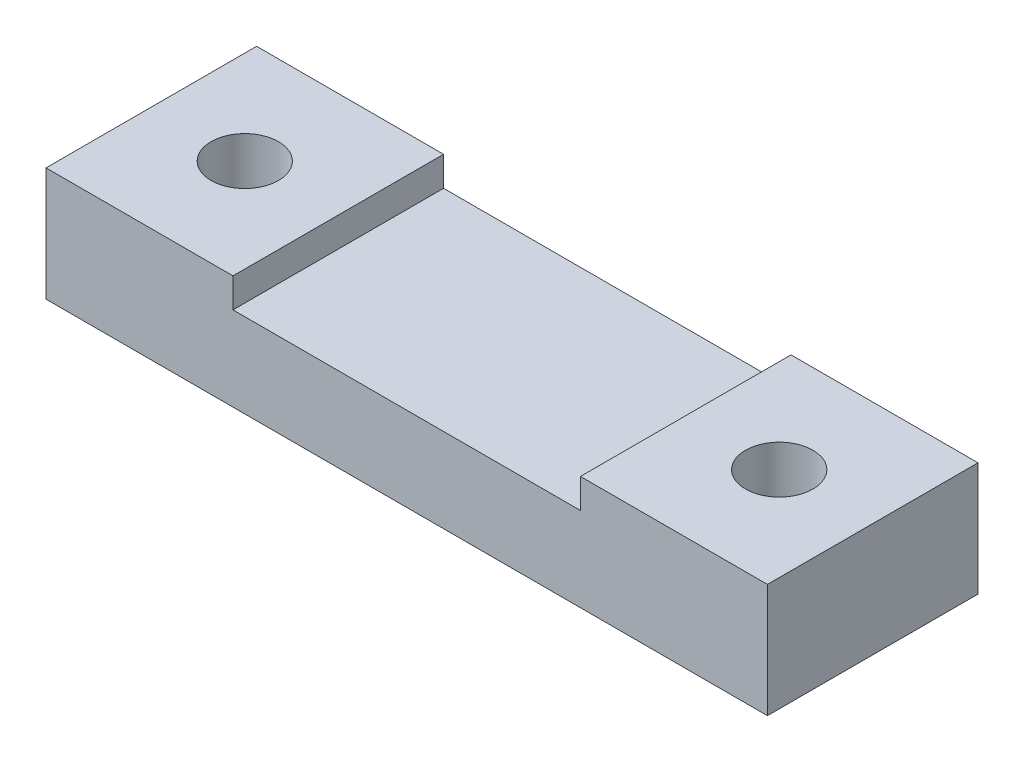
ISO-10303-21;
HEADER;
FILE_DESCRIPTION(('STEP AP214'),'2;1');
FILE_NAME('part.step','',(''),(''),'','','');
FILE_SCHEMA(('AUTOMOTIVE_DESIGN { 1 0 10303 214 1 1 1 1 }'));
ENDSEC;
DATA;
#1=APPLICATION_CONTEXT('core data for automotive mechanical design processes');
#2=APPLICATION_PROTOCOL_DEFINITION('international standard','automotive_design',2000,#1);
#3=PRODUCT_CONTEXT('',#1,'mechanical');
#4=PRODUCT('Part','Part','',(#3));
#5=PRODUCT_RELATED_PRODUCT_CATEGORY('part','',(#4));
#6=PRODUCT_DEFINITION_FORMATION('','',#4);
#7=PRODUCT_DEFINITION_CONTEXT('part definition',#1,'design');
#8=PRODUCT_DEFINITION('design','',#6,#7);
#9=PRODUCT_DEFINITION_SHAPE('','',#8);
#10=(LENGTH_UNIT() NAMED_UNIT(*) SI_UNIT(.MILLI.,.METRE.));
#11=(NAMED_UNIT(*) PLANE_ANGLE_UNIT() SI_UNIT($,.RADIAN.));
#12=(NAMED_UNIT(*) SI_UNIT($,.STERADIAN.) SOLID_ANGLE_UNIT());
#13=UNCERTAINTY_MEASURE_WITH_UNIT(LENGTH_MEASURE(1.E-05),#10,'distance_accuracy_value','');
#14=(GEOMETRIC_REPRESENTATION_CONTEXT(3) GLOBAL_UNCERTAINTY_ASSIGNED_CONTEXT((#13)) GLOBAL_UNIT_ASSIGNED_CONTEXT((#10,
#11,#12)) REPRESENTATION_CONTEXT('',''));
#15=CARTESIAN_POINT('',(0.,0.,0.));
#16=DIRECTION('',(0.,0.,1.));
#17=DIRECTION('',(1.,0.,0.));
#18=AXIS2_PLACEMENT_3D('',#15,#16,#17);
#19=CARTESIAN_POINT('',(0.,0.,0.));
#20=DIRECTION('',(0.,1.,0.));
#21=DIRECTION('',(0.,0.,1.));
#22=AXIS2_PLACEMENT_3D('',#19,#20,#21);
#23=PLANE('',#22);
#24=DIRECTION('',(1.,0.,0.));
#25=VECTOR('',#24,1.);
#26=CARTESIAN_POINT('',(0.,0.,0.));
#27=LINE('',#26,#25);
#28=CARTESIAN_POINT('',(8.88,0.,0.));
#29=VERTEX_POINT('',#28);
#30=CARTESIAN_POINT('',(25.38,0.,0.));
#31=VERTEX_POINT('',#30);
#32=EDGE_CURVE('E54',#29,#31,#27,.T.);
#33=ORIENTED_EDGE('',*,*,#32,.T.);
#34=DIRECTION('',(0.,0.,1.));
#35=VECTOR('',#34,1.);
#36=CARTESIAN_POINT('',(25.38,0.,0.));
#37=LINE('',#36,#35);
#38=CARTESIAN_POINT('',(25.38,0.,-10.));
#39=VERTEX_POINT('',#38);
#40=EDGE_CURVE('E59',#39,#31,#37,.T.);
#41=ORIENTED_EDGE('',*,*,#40,.F.);
#42=DIRECTION('',(1.,0.,0.));
#43=VECTOR('',#42,1.);
#44=CARTESIAN_POINT('',(0.,0.,-10.));
#45=LINE('',#44,#43);
#46=CARTESIAN_POINT('',(8.88,0.,-10.));
#47=VERTEX_POINT('',#46);
#48=EDGE_CURVE('E110',#47,#39,#45,.T.);
#49=ORIENTED_EDGE('',*,*,#48,.F.);
#50=DIRECTION('',(0.,0.,1.));
#51=VECTOR('',#50,1.);
#52=CARTESIAN_POINT('',(8.88,0.,0.));
#53=LINE('',#52,#51);
#54=EDGE_CURVE('E157',#47,#29,#53,.T.);
#55=ORIENTED_EDGE('',*,*,#54,.T.);
#56=EDGE_LOOP('',(#33,#41,#49,#55));
#57=FACE_BOUND('',#56,.T.);
#58=ADVANCED_FACE('F39',(#57),#23,.T.);
#59=CARTESIAN_POINT('',(0.,1.4,-10.));
#60=DIRECTION('',(0.,0.,-1.));
#61=DIRECTION('',(-1.,0.,0.));
#62=AXIS2_PLACEMENT_3D('',#59,#60,#61);
#63=PLANE('',#62);
#64=DIRECTION('',(0.,-1.,0.));
#65=VECTOR('',#64,1.);
#66=CARTESIAN_POINT('',(8.88,1.4,-10.));
#67=LINE('',#66,#65);
#68=CARTESIAN_POINT('',(8.88,1.4,-10.));
#69=VERTEX_POINT('',#68);
#70=EDGE_CURVE('E173',#69,#47,#67,.T.);
#71=ORIENTED_EDGE('',*,*,#70,.T.);
#72=ORIENTED_EDGE('',*,*,#48,.T.);
#73=DIRECTION('',(0.,-1.,0.));
#74=VECTOR('',#73,1.);
#75=CARTESIAN_POINT('',(25.38,1.4,-10.));
#76=LINE('',#75,#74);
#77=CARTESIAN_POINT('',(25.38,1.4,-10.));
#78=VERTEX_POINT('',#77);
#79=EDGE_CURVE('E104',#78,#39,#76,.T.);
#80=ORIENTED_EDGE('',*,*,#79,.F.);
#81=DIRECTION('',(1.,0.,0.));
#82=VECTOR('',#81,1.);
#83=CARTESIAN_POINT('',(0.,1.4,-10.));
#84=LINE('',#83,#82);
#85=CARTESIAN_POINT('',(34.26,1.4,-10.));
#86=VERTEX_POINT('',#85);
#87=EDGE_CURVE('E109',#78,#86,#84,.T.);
#88=ORIENTED_EDGE('',*,*,#87,.T.);
#89=DIRECTION('',(0.,1.,0.));
#90=VECTOR('',#89,1.);
#91=CARTESIAN_POINT('',(34.26,-4.,-10.));
#92=LINE('',#91,#90);
#93=CARTESIAN_POINT('',(34.26,-4.,-10.));
#94=VERTEX_POINT('',#93);
#95=EDGE_CURVE('E152',#94,#86,#92,.T.);
#96=ORIENTED_EDGE('',*,*,#95,.F.);
#97=DIRECTION('',(1.,0.,0.));
#98=VECTOR('',#97,1.);
#99=CARTESIAN_POINT('',(0.,-4.,-10.));
#100=LINE('',#99,#98);
#101=CARTESIAN_POINT('',(0.,-4.,-10.));
#102=VERTEX_POINT('',#101);
#103=EDGE_CURVE('E141',#102,#94,#100,.T.);
#104=ORIENTED_EDGE('',*,*,#103,.F.);
#105=DIRECTION('',(0.,-1.,0.));
#106=VECTOR('',#105,1.);
#107=CARTESIAN_POINT('',(0.,1.4,-10.));
#108=LINE('',#107,#106);
#109=CARTESIAN_POINT('',(0.,1.4,-10.));
#110=VERTEX_POINT('',#109);
#111=EDGE_CURVE('E11',#110,#102,#108,.T.);
#112=ORIENTED_EDGE('',*,*,#111,.F.);
#113=DIRECTION('',(1.,0.,0.));
#114=VECTOR('',#113,1.);
#115=CARTESIAN_POINT('',(0.,1.4,-10.));
#116=LINE('',#115,#114);
#117=EDGE_CURVE('E162',#110,#69,#116,.T.);
#118=ORIENTED_EDGE('',*,*,#117,.T.);
#119=EDGE_LOOP('',(#71,#72,#80,#88,#96,#104,#112,#118));
#120=FACE_BOUND('',#119,.T.);
#121=ADVANCED_FACE('F106',(#120),#63,.T.);
#122=CARTESIAN_POINT('',(0.,1.4,0.));
#123=DIRECTION('',(-1.,0.,0.));
#124=DIRECTION('',(0.,0.,1.));
#125=AXIS2_PLACEMENT_3D('',#122,#123,#124);
#126=PLANE('',#125);
#127=ORIENTED_EDGE('',*,*,#111,.T.);
#128=DIRECTION('',(0.,0.,-1.));
#129=VECTOR('',#128,1.);
#130=CARTESIAN_POINT('',(0.,-4.,0.));
#131=LINE('',#130,#129);
#132=CARTESIAN_POINT('',(0.,-4.,0.));
#133=VERTEX_POINT('',#132);
#134=EDGE_CURVE('E143',#133,#102,#131,.T.);
#135=ORIENTED_EDGE('',*,*,#134,.F.);
#136=DIRECTION('',(0.,-1.,0.));
#137=VECTOR('',#136,1.);
#138=CARTESIAN_POINT('',(0.,1.4,0.));
#139=LINE('',#138,#137);
#140=CARTESIAN_POINT('',(0.,1.4,0.));
#141=VERTEX_POINT('',#140);
#142=EDGE_CURVE('E47',#141,#133,#139,.T.);
#143=ORIENTED_EDGE('',*,*,#142,.F.);
#144=DIRECTION('',(0.,0.,-1.));
#145=VECTOR('',#144,1.);
#146=CARTESIAN_POINT('',(0.,1.4,0.));
#147=LINE('',#146,#145);
#148=EDGE_CURVE('E165',#141,#110,#147,.T.);
#149=ORIENTED_EDGE('',*,*,#148,.T.);
#150=EDGE_LOOP('',(#127,#135,#143,#149));
#151=FACE_BOUND('',#150,.T.);
#152=ADVANCED_FACE('F185',(#151),#126,.T.);
#153=CARTESIAN_POINT('',(0.,1.4,0.));
#154=DIRECTION('',(0.,0.,-1.));
#155=DIRECTION('',(-1.,0.,0.));
#156=AXIS2_PLACEMENT_3D('',#153,#154,#155);
#157=PLANE('',#156);
#158=ORIENTED_EDGE('',*,*,#142,.T.);
#159=DIRECTION('',(1.,0.,0.));
#160=VECTOR('',#159,1.);
#161=CARTESIAN_POINT('',(0.,-4.,0.));
#162=LINE('',#161,#160);
#163=CARTESIAN_POINT('',(34.26,-4.,0.));
#164=VERTEX_POINT('',#163);
#165=EDGE_CURVE('E146',#133,#164,#162,.T.);
#166=ORIENTED_EDGE('',*,*,#165,.T.);
#167=DIRECTION('',(0.,1.,0.));
#168=VECTOR('',#167,1.);
#169=CARTESIAN_POINT('',(34.26,-4.,0.));
#170=LINE('',#169,#168);
#171=CARTESIAN_POINT('',(34.26,1.4,0.));
#172=VERTEX_POINT('',#171);
#173=EDGE_CURVE('E155',#164,#172,#170,.T.);
#174=ORIENTED_EDGE('',*,*,#173,.T.);
#175=DIRECTION('',(1.,0.,0.));
#176=VECTOR('',#175,1.);
#177=CARTESIAN_POINT('',(0.,1.4,0.));
#178=LINE('',#177,#176);
#179=CARTESIAN_POINT('',(25.38,1.4,0.));
#180=VERTEX_POINT('',#179);
#181=EDGE_CURVE('E120',#180,#172,#178,.T.);
#182=ORIENTED_EDGE('',*,*,#181,.F.);
#183=DIRECTION('',(0.,-1.,0.));
#184=VECTOR('',#183,1.);
#185=CARTESIAN_POINT('',(25.38,1.4,0.));
#186=LINE('',#185,#184);
#187=EDGE_CURVE('E112',#180,#31,#186,.T.);
#188=ORIENTED_EDGE('',*,*,#187,.T.);
#189=ORIENTED_EDGE('',*,*,#32,.F.);
#190=DIRECTION('',(0.,-1.,0.));
#191=VECTOR('',#190,1.);
#192=CARTESIAN_POINT('',(8.88,1.4,0.));
#193=LINE('',#192,#191);
#194=CARTESIAN_POINT('',(8.88,1.4,0.));
#195=VERTEX_POINT('',#194);
#196=EDGE_CURVE('E176',#195,#29,#193,.T.);
#197=ORIENTED_EDGE('',*,*,#196,.F.);
#198=DIRECTION('',(1.,0.,0.));
#199=VECTOR('',#198,1.);
#200=CARTESIAN_POINT('',(0.,1.4,0.));
#201=LINE('',#200,#199);
#202=EDGE_CURVE('E168',#141,#195,#201,.T.);
#203=ORIENTED_EDGE('',*,*,#202,.F.);
#204=EDGE_LOOP('',(#158,#166,#174,#182,#188,#189,#197,#203));
#205=FACE_BOUND('',#204,.T.);
#206=ADVANCED_FACE('F180',(#205),#157,.F.);
#207=CARTESIAN_POINT('',(4.44,1.4,-5.));
#208=DIRECTION('',(0.,-1.,0.));
#209=DIRECTION('',(0.,0.,-1.));
#210=AXIS2_PLACEMENT_3D('',#207,#208,#209);
#211=CYLINDRICAL_SURFACE('',#210,1.6);
#212=CARTESIAN_POINT('',(4.44,1.4,-5.));
#213=DIRECTION('',(0.,1.,0.));
#214=DIRECTION('',(0.,0.,1.));
#215=AXIS2_PLACEMENT_3D('',#212,#213,#214);
#216=CIRCLE('',#215,1.6);
#217=CARTESIAN_POINT('',(4.44,1.4,-3.4));
#218=VERTEX_POINT('',#217);
#219=EDGE_CURVE('E159',#218,#218,#216,.T.);
#220=ORIENTED_EDGE('',*,*,#219,.T.);
#221=EDGE_LOOP('',(#220));
#222=FACE_BOUND('',#221,.T.);
#223=CARTESIAN_POINT('',(4.44,-4.,-5.));
#224=DIRECTION('',(0.,1.,0.));
#225=DIRECTION('',(0.,0.,1.));
#226=AXIS2_PLACEMENT_3D('',#223,#224,#225);
#227=CIRCLE('',#226,1.6);
#228=CARTESIAN_POINT('',(4.44,-4.,-3.4));
#229=VERTEX_POINT('',#228);
#230=EDGE_CURVE('E149',#229,#229,#227,.T.);
#231=ORIENTED_EDGE('',*,*,#230,.F.);
#232=EDGE_LOOP('',(#231));
#233=FACE_BOUND('',#232,.T.);
#234=ADVANCED_FACE('F41',(#222,#233),#211,.F.);
#235=CARTESIAN_POINT('',(8.88,1.4,0.));
#236=DIRECTION('',(1.,0.,0.));
#237=DIRECTION('',(0.,0.,-1.));
#238=AXIS2_PLACEMENT_3D('',#235,#236,#237);
#239=PLANE('',#238);
#240=ORIENTED_EDGE('',*,*,#54,.F.);
#241=ORIENTED_EDGE('',*,*,#70,.F.);
#242=DIRECTION('',(0.,0.,1.));
#243=VECTOR('',#242,1.);
#244=CARTESIAN_POINT('',(8.88,1.4,0.));
#245=LINE('',#244,#243);
#246=EDGE_CURVE('E170',#69,#195,#245,.T.);
#247=ORIENTED_EDGE('',*,*,#246,.T.);
#248=ORIENTED_EDGE('',*,*,#196,.T.);
#249=EDGE_LOOP('',(#240,#241,#247,#248));
#250=FACE_BOUND('',#249,.T.);
#251=ADVANCED_FACE('F196',(#250),#239,.T.);
#252=CARTESIAN_POINT('',(0.,1.4,0.));
#253=DIRECTION('',(0.,1.,0.));
#254=DIRECTION('',(0.,0.,1.));
#255=AXIS2_PLACEMENT_3D('',#252,#253,#254);
#256=PLANE('',#255);
#257=ORIENTED_EDGE('',*,*,#219,.F.);
#258=EDGE_LOOP('',(#257));
#259=FACE_BOUND('',#258,.T.);
#260=ORIENTED_EDGE('',*,*,#117,.F.);
#261=ORIENTED_EDGE('',*,*,#148,.F.);
#262=ORIENTED_EDGE('',*,*,#202,.T.);
#263=ORIENTED_EDGE('',*,*,#246,.F.);
#264=EDGE_LOOP('',(#260,#261,#262,#263));
#265=FACE_BOUND('',#264,.T.);
#266=ADVANCED_FACE('F199',(#259,#265),#256,.T.);
#267=CARTESIAN_POINT('',(34.26,-4.,0.));
#268=DIRECTION('',(1.,0.,0.));
#269=DIRECTION('',(0.,0.,-1.));
#270=AXIS2_PLACEMENT_3D('',#267,#268,#269);
#271=PLANE('',#270);
#272=ORIENTED_EDGE('',*,*,#95,.T.);
#273=DIRECTION('',(0.,0.,-1.));
#274=VECTOR('',#273,1.);
#275=CARTESIAN_POINT('',(34.26,1.4,0.));
#276=LINE('',#275,#274);
#277=EDGE_CURVE('E125',#172,#86,#276,.T.);
#278=ORIENTED_EDGE('',*,*,#277,.F.);
#279=ORIENTED_EDGE('',*,*,#173,.F.);
#280=DIRECTION('',(0.,0.,-1.));
#281=VECTOR('',#280,1.);
#282=CARTESIAN_POINT('',(34.26,-4.,0.));
#283=LINE('',#282,#281);
#284=EDGE_CURVE('E138',#164,#94,#283,.T.);
#285=ORIENTED_EDGE('',*,*,#284,.T.);
#286=EDGE_LOOP('',(#272,#278,#279,#285));
#287=FACE_BOUND('',#286,.T.);
#288=ADVANCED_FACE('F192',(#287),#271,.T.);
#289=CARTESIAN_POINT('',(29.82,-4.,-5.));
#290=DIRECTION('',(0.,1.,0.));
#291=DIRECTION('',(0.,0.,1.));
#292=AXIS2_PLACEMENT_3D('',#289,#290,#291);
#293=CYLINDRICAL_SURFACE('',#292,1.6);
#294=CARTESIAN_POINT('',(29.82,-4.,-5.));
#295=DIRECTION('',(0.,1.,0.));
#296=DIRECTION('',(0.,0.,1.));
#297=AXIS2_PLACEMENT_3D('',#294,#295,#296);
#298=CIRCLE('',#297,1.6);
#299=CARTESIAN_POINT('',(29.82,-4.,-3.4));
#300=VERTEX_POINT('',#299);
#301=EDGE_CURVE('E135',#300,#300,#298,.T.);
#302=ORIENTED_EDGE('',*,*,#301,.F.);
#303=EDGE_LOOP('',(#302));
#304=FACE_BOUND('',#303,.T.);
#305=CARTESIAN_POINT('',(29.82,1.4,-5.));
#306=DIRECTION('',(0.,1.,0.));
#307=DIRECTION('',(0.,0.,1.));
#308=AXIS2_PLACEMENT_3D('',#305,#306,#307);
#309=CIRCLE('',#308,1.6);
#310=CARTESIAN_POINT('',(29.82,1.4,-3.4));
#311=VERTEX_POINT('',#310);
#312=EDGE_CURVE('E126',#311,#311,#309,.T.);
#313=ORIENTED_EDGE('',*,*,#312,.T.);
#314=EDGE_LOOP('',(#313));
#315=FACE_BOUND('',#314,.T.);
#316=ADVANCED_FACE('F210',(#304,#315),#293,.F.);
#317=CARTESIAN_POINT('',(0.,-4.,0.));
#318=DIRECTION('',(0.,1.,0.));
#319=DIRECTION('',(0.,0.,1.));
#320=AXIS2_PLACEMENT_3D('',#317,#318,#319);
#321=PLANE('',#320);
#322=ORIENTED_EDGE('',*,*,#301,.T.);
#323=EDGE_LOOP('',(#322));
#324=FACE_BOUND('',#323,.T.);
#325=ORIENTED_EDGE('',*,*,#284,.F.);
#326=ORIENTED_EDGE('',*,*,#165,.F.);
#327=ORIENTED_EDGE('',*,*,#134,.T.);
#328=ORIENTED_EDGE('',*,*,#103,.T.);
#329=EDGE_LOOP('',(#325,#326,#327,#328));
#330=FACE_BOUND('',#329,.T.);
#331=ORIENTED_EDGE('',*,*,#230,.T.);
#332=EDGE_LOOP('',(#331));
#333=FACE_BOUND('',#332,.T.);
#334=ADVANCED_FACE('F189',(#324,#330,#333),#321,.F.);
#335=CARTESIAN_POINT('',(25.38,1.4,0.));
#336=DIRECTION('',(1.,0.,0.));
#337=DIRECTION('',(0.,0.,-1.));
#338=AXIS2_PLACEMENT_3D('',#335,#336,#337);
#339=PLANE('',#338);
#340=ORIENTED_EDGE('',*,*,#40,.T.);
#341=ORIENTED_EDGE('',*,*,#187,.F.);
#342=DIRECTION('',(0.,0.,1.));
#343=VECTOR('',#342,1.);
#344=CARTESIAN_POINT('',(25.38,1.4,0.));
#345=LINE('',#344,#343);
#346=EDGE_CURVE('E116',#78,#180,#345,.T.);
#347=ORIENTED_EDGE('',*,*,#346,.F.);
#348=ORIENTED_EDGE('',*,*,#79,.T.);
#349=EDGE_LOOP('',(#340,#341,#347,#348));
#350=FACE_BOUND('',#349,.T.);
#351=ADVANCED_FACE('F117',(#350),#339,.F.);
#352=CARTESIAN_POINT('',(0.,1.4,0.));
#353=DIRECTION('',(0.,1.,0.));
#354=DIRECTION('',(0.,0.,1.));
#355=AXIS2_PLACEMENT_3D('',#352,#353,#354);
#356=PLANE('',#355);
#357=ORIENTED_EDGE('',*,*,#312,.F.);
#358=EDGE_LOOP('',(#357));
#359=FACE_BOUND('',#358,.T.);
#360=ORIENTED_EDGE('',*,*,#87,.F.);
#361=ORIENTED_EDGE('',*,*,#346,.T.);
#362=ORIENTED_EDGE('',*,*,#181,.T.);
#363=ORIENTED_EDGE('',*,*,#277,.T.);
#364=EDGE_LOOP('',(#360,#361,#362,#363));
#365=FACE_BOUND('',#364,.T.);
#366=ADVANCED_FACE('F123',(#359,#365),#356,.T.);
#367=CLOSED_SHELL('',(#58,#121,#152,#206,#234,#251,#266,#288,#316,#334,#351,#366));
#368=MANIFOLD_SOLID_BREP('B2',#367);
#369=ADVANCED_BREP_SHAPE_REPRESENTATION('',(#18,#368),#14);
#370=SHAPE_DEFINITION_REPRESENTATION(#9,#369);
ENDSEC;
END-ISO-10303-21;
